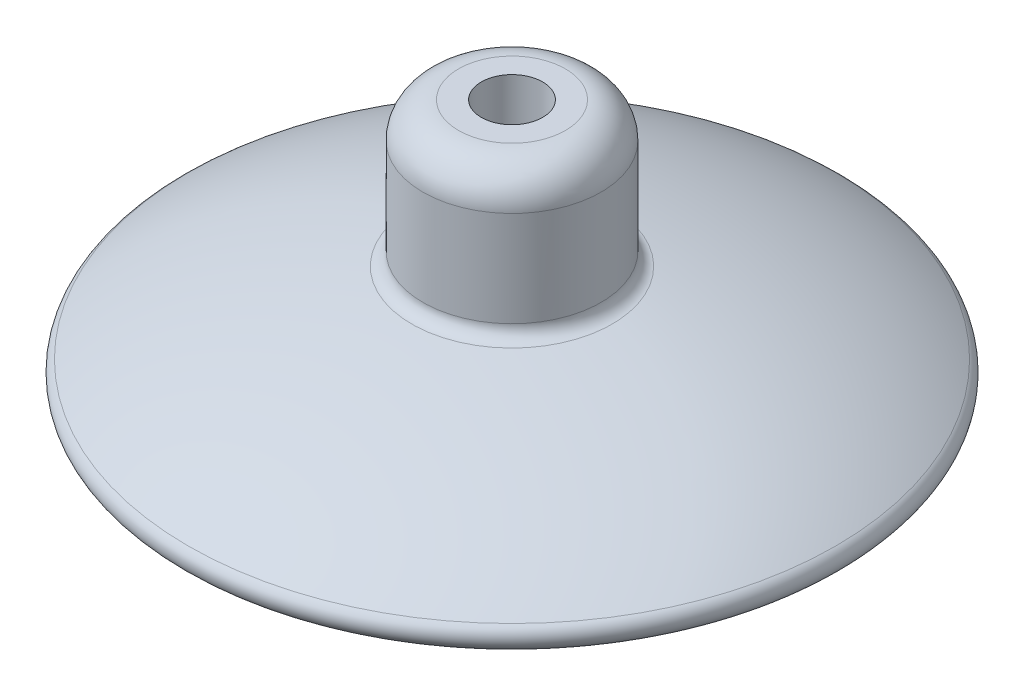
ISO-10303-21;
HEADER;
FILE_DESCRIPTION(('STEP AP214'),'2;1');
FILE_NAME('part.step','',(''),(''),'','','');
FILE_SCHEMA(('AUTOMOTIVE_DESIGN { 1 0 10303 214 1 1 1 1 }'));
ENDSEC;
DATA;
#1=APPLICATION_CONTEXT('core data for automotive mechanical design processes');
#2=APPLICATION_PROTOCOL_DEFINITION('international standard','automotive_design',2000,#1);
#3=PRODUCT_CONTEXT('',#1,'mechanical');
#4=PRODUCT('Part','Part','',(#3));
#5=PRODUCT_RELATED_PRODUCT_CATEGORY('part','',(#4));
#6=PRODUCT_DEFINITION_FORMATION('','',#4);
#7=PRODUCT_DEFINITION_CONTEXT('part definition',#1,'design');
#8=PRODUCT_DEFINITION('design','',#6,#7);
#9=PRODUCT_DEFINITION_SHAPE('','',#8);
#10=(LENGTH_UNIT() NAMED_UNIT(*) SI_UNIT(.MILLI.,.METRE.));
#11=(NAMED_UNIT(*) PLANE_ANGLE_UNIT() SI_UNIT($,.RADIAN.));
#12=(NAMED_UNIT(*) SI_UNIT($,.STERADIAN.) SOLID_ANGLE_UNIT());
#13=UNCERTAINTY_MEASURE_WITH_UNIT(LENGTH_MEASURE(1.E-05),#10,'distance_accuracy_value','');
#14=(GEOMETRIC_REPRESENTATION_CONTEXT(3) GLOBAL_UNCERTAINTY_ASSIGNED_CONTEXT((#13)) GLOBAL_UNIT_ASSIGNED_CONTEXT((#10,
#11,#12)) REPRESENTATION_CONTEXT('',''));
#15=CARTESIAN_POINT('',(0.,0.,0.));
#16=DIRECTION('',(0.,0.,1.));
#17=DIRECTION('',(1.,0.,0.));
#18=AXIS2_PLACEMENT_3D('',#15,#16,#17);
#19=CARTESIAN_POINT('',(0.,8.,0.));
#20=DIRECTION('',(0.,-1.,0.));
#21=DIRECTION('',(0.,0.,-1.));
#22=AXIS2_PLACEMENT_3D('',#19,#20,#21);
#23=CYLINDRICAL_SURFACE('',#22,5.);
#24=CARTESIAN_POINT('',(0.,6.,0.));
#25=DIRECTION('',(0.,1.,0.));
#26=DIRECTION('',(0.,0.,1.));
#27=AXIS2_PLACEMENT_3D('',#24,#25,#26);
#28=CIRCLE('',#27,5.);
#29=CARTESIAN_POINT('',(0.,6.,5.));
#30=VERTEX_POINT('',#29);
#31=EDGE_CURVE('E10',#30,#30,#28,.F.);
#32=ORIENTED_EDGE('',*,*,#31,.T.);
#33=EDGE_LOOP('',(#32));
#34=FACE_BOUND('',#33,.T.);
#35=CARTESIAN_POINT('',(0.,0.639025960110252,0.));
#36=DIRECTION('',(0.,1.,0.));
#37=DIRECTION('',(-1.,0.,0.));
#38=AXIS2_PLACEMENT_3D('',#35,#36,#37);
#39=CIRCLE('',#38,5.);
#40=CARTESIAN_POINT('',(-5.,0.639025960110252,0.));
#41=VERTEX_POINT('',#40);
#42=EDGE_CURVE('E43',#41,#41,#39,.T.);
#43=ORIENTED_EDGE('',*,*,#42,.T.);
#44=EDGE_LOOP('',(#43));
#45=FACE_BOUND('',#44,.T.);
#46=ADVANCED_FACE('F32',(#34,#45),#23,.T.);
#47=CARTESIAN_POINT('',(0.,8.,0.));
#48=DIRECTION('',(0.,1.,0.));
#49=DIRECTION('',(0.,0.,1.));
#50=AXIS2_PLACEMENT_3D('',#47,#48,#49);
#51=PLANE('',#50);
#52=CARTESIAN_POINT('',(0.,8.,0.));
#53=DIRECTION('',(0.,1.,0.));
#54=DIRECTION('',(0.,0.,1.));
#55=AXIS2_PLACEMENT_3D('',#52,#53,#54);
#56=CIRCLE('',#55,3.);
#57=CARTESIAN_POINT('',(0.,8.,3.));
#58=VERTEX_POINT('',#57);
#59=EDGE_CURVE('E39',#58,#58,#56,.T.);
#60=ORIENTED_EDGE('',*,*,#59,.T.);
#61=EDGE_LOOP('',(#60));
#62=FACE_BOUND('',#61,.T.);
#63=CARTESIAN_POINT('',(0.,8.,0.));
#64=DIRECTION('',(0.,-1.,0.));
#65=DIRECTION('',(1.,0.,0.));
#66=AXIS2_PLACEMENT_3D('',#63,#64,#65);
#67=CIRCLE('',#66,1.725);
#68=CARTESIAN_POINT('',(1.725,8.,0.));
#69=VERTEX_POINT('',#68);
#70=EDGE_CURVE('E174',#69,#69,#67,.T.);
#71=ORIENTED_EDGE('',*,*,#70,.T.);
#72=EDGE_LOOP('',(#71));
#73=FACE_BOUND('',#72,.T.);
#74=ADVANCED_FACE('F74',(#62,#73),#51,.T.);
#75=CARTESIAN_POINT('',(-20.,-6.,0.));
#76=CARTESIAN_POINT('',(-14.6562870370906,-1.49204321292985,0.));
#77=CARTESIAN_POINT('',(-5.,0.,0.));
#78=B_SPLINE_CURVE_WITH_KNOTS('',2,(#75,#76,#77),.UNSPECIFIED.,.F.,.F.,(3,3),(0.,1.),.UNSPECIFIED.);
#79=CARTESIAN_POINT('',(0.,0.,0.));
#80=DIRECTION('',(0.,1.,0.));
#81=AXIS1_PLACEMENT('',#79,#80);
#82=SURFACE_OF_REVOLUTION('',#78,#81);
#83=CARTESIAN_POINT('',(0.,-4.62579225033203,0.));
#84=DIRECTION('',(0.,1.,0.));
#85=DIRECTION('',(-1.,0.,0.));
#86=AXIS2_PLACEMENT_3D('',#83,#84,#85);
#87=CIRCLE('',#86,18.1663054537753);
#88=CARTESIAN_POINT('',(-18.1663054537753,-4.62579225033203,0.));
#89=VERTEX_POINT('',#88);
#90=EDGE_CURVE('E52',#89,#89,#87,.T.);
#91=ORIENTED_EDGE('',*,*,#90,.T.);
#92=EDGE_LOOP('',(#91));
#93=FACE_BOUND('',#92,.T.);
#94=CARTESIAN_POINT('',(0.,-0.100710455540644,0.));
#95=DIRECTION('',(0.,1.,0.));
#96=DIRECTION('',(-1.,0.,0.));
#97=AXIS2_PLACEMENT_3D('',#94,#95,#96);
#98=CIRCLE('',#97,5.62634711746197);
#99=CARTESIAN_POINT('',(-5.62634711746197,-0.100710455540645,0.));
#100=VERTEX_POINT('',#99);
#101=EDGE_CURVE('E55',#100,#100,#98,.F.);
#102=ORIENTED_EDGE('',*,*,#101,.T.);
#103=EDGE_LOOP('',(#102));
#104=FACE_BOUND('',#103,.T.);
#105=ADVANCED_FACE('F69',(#93,#104),#82,.T.);
#106=CARTESIAN_POINT('',(0.,-6.,0.));
#107=DIRECTION('',(0.,1.,0.));
#108=DIRECTION('',(-1.,0.,0.));
#109=AXIS2_PLACEMENT_3D('',#106,#107,#108);
#110=PLANE('',#109);
#111=CARTESIAN_POINT('',(0.,-6.,0.));
#112=DIRECTION('',(0.,1.,0.));
#113=DIRECTION('',(-1.,0.,0.));
#114=AXIS2_PLACEMENT_3D('',#111,#112,#113);
#115=CIRCLE('',#114,17.7505354629698);
#116=CARTESIAN_POINT('',(-17.7505354629698,-6.,0.));
#117=VERTEX_POINT('',#116);
#118=EDGE_CURVE('E47',#117,#117,#115,.F.);
#119=ORIENTED_EDGE('',*,*,#118,.T.);
#120=EDGE_LOOP('',(#119));
#121=FACE_BOUND('',#120,.T.);
#122=CARTESIAN_POINT('',(0.,-6.,0.));
#123=DIRECTION('',(0.,-1.,0.));
#124=DIRECTION('',(1.,0.,0.));
#125=AXIS2_PLACEMENT_3D('',#122,#123,#124);
#126=CIRCLE('',#125,3.45);
#127=CARTESIAN_POINT('',(3.45,-6.,0.));
#128=VERTEX_POINT('',#127);
#129=EDGE_CURVE('E63',#128,#128,#126,.T.);
#130=ORIENTED_EDGE('',*,*,#129,.F.);
#131=EDGE_LOOP('',(#130));
#132=FACE_BOUND('',#131,.T.);
#133=ADVANCED_FACE('F73',(#121,#132),#110,.F.);
#134=CARTESIAN_POINT('',(0.,-1.81,0.));
#135=DIRECTION('',(0.,-1.,0.));
#136=DIRECTION('',(1.,0.,0.));
#137=AXIS2_PLACEMENT_3D('',#134,#135,#136);
#138=CYLINDRICAL_SURFACE('',#137,3.45);
#139=CARTESIAN_POINT('',(0.,-1.81,0.));
#140=DIRECTION('',(0.,-1.,0.));
#141=DIRECTION('',(1.,0.,0.));
#142=AXIS2_PLACEMENT_3D('',#139,#140,#141);
#143=CIRCLE('',#142,3.45);
#144=CARTESIAN_POINT('',(3.45,-1.81,0.));
#145=VERTEX_POINT('',#144);
#146=EDGE_CURVE('E58',#145,#145,#143,.T.);
#147=ORIENTED_EDGE('',*,*,#146,.F.);
#148=EDGE_LOOP('',(#147));
#149=FACE_BOUND('',#148,.T.);
#150=ORIENTED_EDGE('',*,*,#129,.T.);
#151=EDGE_LOOP('',(#150));
#152=FACE_BOUND('',#151,.T.);
#153=ADVANCED_FACE('F134',(#149,#152),#138,.F.);
#154=CARTESIAN_POINT('',(0.,-1.81,0.));
#155=DIRECTION('',(0.,-1.,0.));
#156=DIRECTION('',(1.,0.,0.));
#157=AXIS2_PLACEMENT_3D('',#154,#155,#156);
#158=PLANE('',#157);
#159=CARTESIAN_POINT('',(0.,-1.81,0.));
#160=DIRECTION('',(0.,-1.,0.));
#161=DIRECTION('',(1.,0.,0.));
#162=AXIS2_PLACEMENT_3D('',#159,#160,#161);
#163=CIRCLE('',#162,1.725);
#164=CARTESIAN_POINT('',(1.725,-1.81,0.));
#165=VERTEX_POINT('',#164);
#166=EDGE_CURVE('E176',#165,#165,#163,.T.);
#167=ORIENTED_EDGE('',*,*,#166,.F.);
#168=EDGE_LOOP('',(#167));
#169=FACE_BOUND('',#168,.T.);
#170=ORIENTED_EDGE('',*,*,#146,.T.);
#171=EDGE_LOOP('',(#170));
#172=FACE_BOUND('',#171,.T.);
#173=ADVANCED_FACE('F148',(#169,#172),#158,.T.);
#174=CARTESIAN_POINT('',(0.,8.,0.));
#175=DIRECTION('',(0.,-1.,0.));
#176=DIRECTION('',(1.,0.,0.));
#177=AXIS2_PLACEMENT_3D('',#174,#175,#176);
#178=CYLINDRICAL_SURFACE('',#177,1.725);
#179=ORIENTED_EDGE('',*,*,#70,.F.);
#180=EDGE_LOOP('',(#179));
#181=FACE_BOUND('',#180,.T.);
#182=ORIENTED_EDGE('',*,*,#166,.T.);
#183=EDGE_LOOP('',(#182));
#184=FACE_BOUND('',#183,.T.);
#185=ADVANCED_FACE('F84',(#181,#184),#178,.F.);
#186=CARTESIAN_POINT('',(0.,-5.25,0.));
#187=DIRECTION('',(0.,1.,0.));
#188=DIRECTION('',(-1.,0.,0.));
#189=AXIS2_PLACEMENT_3D('',#186,#187,#188);
#190=TOROIDAL_SURFACE('',#189,17.7505354629698,0.75);
#191=ORIENTED_EDGE('',*,*,#118,.F.);
#192=EDGE_LOOP('',(#191));
#193=FACE_BOUND('',#192,.T.);
#194=ORIENTED_EDGE('',*,*,#90,.F.);
#195=EDGE_LOOP('',(#194));
#196=FACE_BOUND('',#195,.T.);
#197=ADVANCED_FACE('F81',(#193,#196),#190,.T.);
#198=CARTESIAN_POINT('',(0.,0.639025960110253,0.));
#199=DIRECTION('',(0.,1.,0.));
#200=DIRECTION('',(-1.,0.,0.));
#201=AXIS2_PLACEMENT_3D('',#198,#199,#200);
#202=TOROIDAL_SURFACE('',#201,5.75,0.75);
#203=ORIENTED_EDGE('',*,*,#101,.F.);
#204=EDGE_LOOP('',(#203));
#205=FACE_BOUND('',#204,.T.);
#206=ORIENTED_EDGE('',*,*,#42,.F.);
#207=EDGE_LOOP('',(#206));
#208=FACE_BOUND('',#207,.T.);
#209=ADVANCED_FACE('F83',(#205,#208),#202,.F.);
#210=CARTESIAN_POINT('',(0.,6.,0.));
#211=DIRECTION('',(0.,1.,0.));
#212=DIRECTION('',(0.,0.,1.));
#213=AXIS2_PLACEMENT_3D('',#210,#211,#212);
#214=TOROIDAL_SURFACE('',#213,3.,2.);
#215=ORIENTED_EDGE('',*,*,#31,.F.);
#216=EDGE_LOOP('',(#215));
#217=FACE_BOUND('',#216,.T.);
#218=ORIENTED_EDGE('',*,*,#59,.F.);
#219=EDGE_LOOP('',(#218));
#220=FACE_BOUND('',#219,.T.);
#221=ADVANCED_FACE('F34',(#217,#220),#214,.T.);
#222=CLOSED_SHELL('',(#46,#74,#105,#133,#153,#173,#185,#197,#209,#221));
#223=MANIFOLD_SOLID_BREP('B2',#222);
#224=ADVANCED_BREP_SHAPE_REPRESENTATION('',(#18,#223),#14);
#225=SHAPE_DEFINITION_REPRESENTATION(#9,#224);
ENDSEC;
END-ISO-10303-21;
